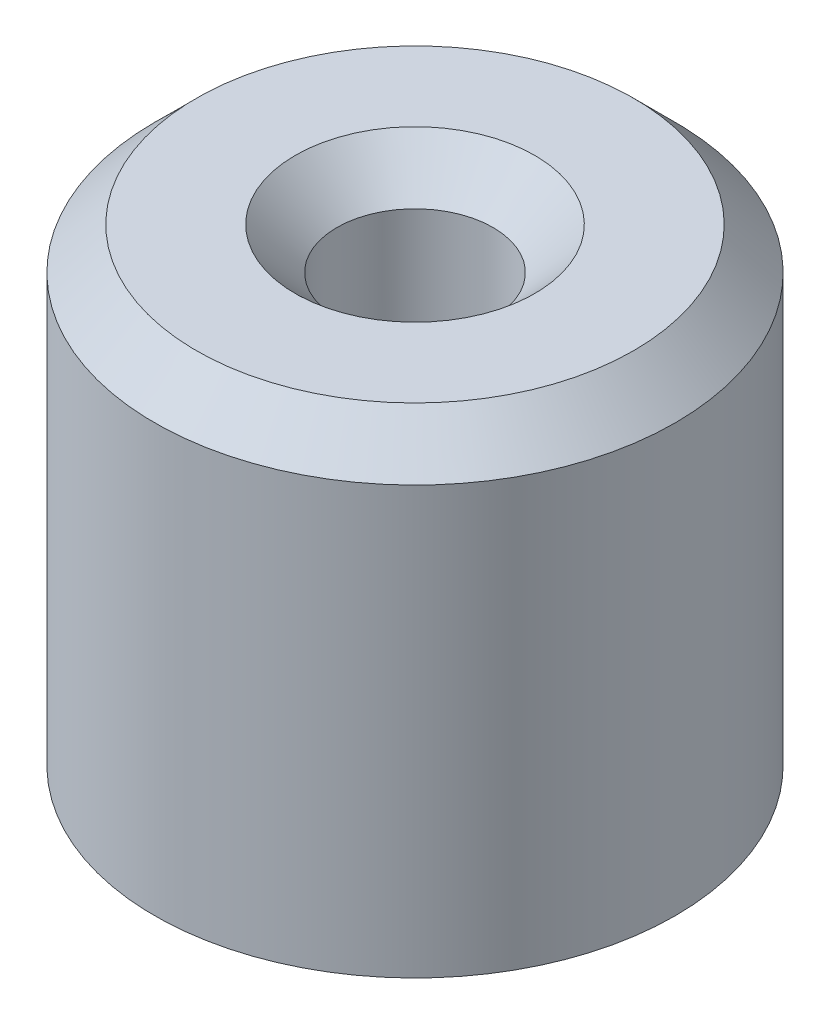
ISO-10303-21;
HEADER;
FILE_DESCRIPTION(('STEP AP214'),'2;1');
FILE_NAME('part.step','',(''),(''),'','','');
FILE_SCHEMA(('AUTOMOTIVE_DESIGN { 1 0 10303 214 1 1 1 1 }'));
ENDSEC;
DATA;
#1=APPLICATION_CONTEXT('core data for automotive mechanical design processes');
#2=APPLICATION_PROTOCOL_DEFINITION('international standard','automotive_design',2000,#1);
#3=PRODUCT_CONTEXT('',#1,'mechanical');
#4=PRODUCT('Part','Part','',(#3));
#5=PRODUCT_RELATED_PRODUCT_CATEGORY('part','',(#4));
#6=PRODUCT_DEFINITION_FORMATION('','',#4);
#7=PRODUCT_DEFINITION_CONTEXT('part definition',#1,'design');
#8=PRODUCT_DEFINITION('design','',#6,#7);
#9=PRODUCT_DEFINITION_SHAPE('','',#8);
#10=(LENGTH_UNIT() NAMED_UNIT(*) SI_UNIT(.MILLI.,.METRE.));
#11=(NAMED_UNIT(*) PLANE_ANGLE_UNIT() SI_UNIT($,.RADIAN.));
#12=(NAMED_UNIT(*) SI_UNIT($,.STERADIAN.) SOLID_ANGLE_UNIT());
#13=UNCERTAINTY_MEASURE_WITH_UNIT(LENGTH_MEASURE(1.E-05),#10,'distance_accuracy_value','');
#14=(GEOMETRIC_REPRESENTATION_CONTEXT(3) GLOBAL_UNCERTAINTY_ASSIGNED_CONTEXT((#13)) GLOBAL_UNIT_ASSIGNED_CONTEXT((#10,
#11,#12)) REPRESENTATION_CONTEXT('',''));
#15=CARTESIAN_POINT('',(0.,0.,0.));
#16=DIRECTION('',(0.,0.,1.));
#17=DIRECTION('',(1.,0.,0.));
#18=AXIS2_PLACEMENT_3D('',#15,#16,#17);
#19=CARTESIAN_POINT('',(16.7831228429026,33.5917620902135,5.85));
#20=DIRECTION('',(0.,-1.,0.));
#21=DIRECTION('',(-1.,0.,0.));
#22=AXIS2_PLACEMENT_3D('',#19,#20,#21);
#23=PLANE('',#22);
#24=CARTESIAN_POINT('',(16.7831228429026,33.5917620902135,5.85));
#25=DIRECTION('',(0.,1.,0.));
#26=DIRECTION('',(1.,0.,0.));
#27=AXIS2_PLACEMENT_3D('',#24,#25,#26);
#28=CIRCLE('',#27,0.75);
#29=CARTESIAN_POINT('',(17.5331228429026,33.5917620902135,5.85));
#30=VERTEX_POINT('',#29);
#31=EDGE_CURVE('E10',#30,#30,#28,.T.);
#32=ORIENTED_EDGE('',*,*,#31,.T.);
#33=EDGE_LOOP('',(#32));
#34=FACE_BOUND('',#33,.T.);
#35=CARTESIAN_POINT('',(16.7831228429026,33.5917620902135,5.85));
#36=DIRECTION('',(0.,-1.,0.));
#37=DIRECTION('',(1.,0.,0.));
#38=AXIS2_PLACEMENT_3D('',#35,#36,#37);
#39=CIRCLE('',#38,2.5);
#40=CARTESIAN_POINT('',(19.2831228429026,33.5917620902135,5.85));
#41=VERTEX_POINT('',#40);
#42=EDGE_CURVE('E33',#41,#41,#39,.T.);
#43=ORIENTED_EDGE('',*,*,#42,.T.);
#44=EDGE_LOOP('',(#43));
#45=FACE_BOUND('',#44,.T.);
#46=ADVANCED_FACE('F15',(#34,#45),#23,.T.);
#47=CARTESIAN_POINT('',(16.7831228429026,34.703035669502,5.85));
#48=DIRECTION('',(0.,-1.,0.));
#49=DIRECTION('',(1.,0.,0.));
#50=AXIS2_PLACEMENT_3D('',#47,#48,#49);
#51=CYLINDRICAL_SURFACE('',#50,0.75);
#52=ORIENTED_EDGE('',*,*,#31,.F.);
#53=EDGE_LOOP('',(#52));
#54=FACE_BOUND('',#53,.T.);
#55=CARTESIAN_POINT('',(16.7831228429026,37.6917620902135,5.85));
#56=DIRECTION('',(0.,-1.,0.));
#57=DIRECTION('',(-1.,0.,0.));
#58=AXIS2_PLACEMENT_3D('',#55,#56,#57);
#59=CIRCLE('',#58,0.75);
#60=CARTESIAN_POINT('',(16.0331228429026,37.6917620902135,5.85));
#61=VERTEX_POINT('',#60);
#62=EDGE_CURVE('E18',#61,#61,#59,.T.);
#63=ORIENTED_EDGE('',*,*,#62,.F.);
#64=EDGE_LOOP('',(#63));
#65=FACE_BOUND('',#64,.T.);
#66=ADVANCED_FACE('F73',(#54,#65),#51,.F.);
#67=CARTESIAN_POINT('',(16.7831228429026,37.8917620902135,5.85));
#68=DIRECTION('',(0.,1.,0.));
#69=DIRECTION('',(-1.,0.,0.));
#70=AXIS2_PLACEMENT_3D('',#67,#68,#69);
#71=CONICAL_SURFACE('',#70,0.95,0.785398163397448);
#72=ORIENTED_EDGE('',*,*,#62,.T.);
#73=EDGE_LOOP('',(#72));
#74=FACE_BOUND('',#73,.T.);
#75=CARTESIAN_POINT('',(16.7831228429026,38.0917620902135,5.85));
#76=DIRECTION('',(0.,1.,0.));
#77=DIRECTION('',(-1.,0.,0.));
#78=AXIS2_PLACEMENT_3D('',#75,#76,#77);
#79=CIRCLE('',#78,1.15);
#80=CARTESIAN_POINT('',(15.6331228429026,38.0917620902135,5.85));
#81=VERTEX_POINT('',#80);
#82=EDGE_CURVE('E40',#81,#81,#79,.T.);
#83=ORIENTED_EDGE('',*,*,#82,.T.);
#84=EDGE_LOOP('',(#83));
#85=FACE_BOUND('',#84,.T.);
#86=ADVANCED_FACE('F53',(#74,#85),#71,.F.);
#87=CARTESIAN_POINT('',(16.7831228429026,34.0917620902135,5.85));
#88=DIRECTION('',(0.,1.,0.));
#89=DIRECTION('',(1.,0.,0.));
#90=AXIS2_PLACEMENT_3D('',#87,#88,#89);
#91=CYLINDRICAL_SURFACE('',#90,2.5);
#92=ORIENTED_EDGE('',*,*,#42,.F.);
#93=EDGE_LOOP('',(#92));
#94=FACE_BOUND('',#93,.T.);
#95=CARTESIAN_POINT('',(16.7831228429026,37.6917620902135,5.85));
#96=DIRECTION('',(0.,1.,0.));
#97=DIRECTION('',(1.,0.,0.));
#98=AXIS2_PLACEMENT_3D('',#95,#96,#97);
#99=CIRCLE('',#98,2.5);
#100=CARTESIAN_POINT('',(19.2831228429026,37.6917620902135,5.85));
#101=VERTEX_POINT('',#100);
#102=EDGE_CURVE('E38',#101,#101,#99,.T.);
#103=ORIENTED_EDGE('',*,*,#102,.F.);
#104=EDGE_LOOP('',(#103));
#105=FACE_BOUND('',#104,.T.);
#106=ADVANCED_FACE('F49',(#94,#105),#91,.T.);
#107=CARTESIAN_POINT('',(16.7831228429026,38.0917620902135,5.85));
#108=DIRECTION('',(0.,1.,0.));
#109=DIRECTION('',(1.,0.,0.));
#110=AXIS2_PLACEMENT_3D('',#107,#108,#109);
#111=PLANE('',#110);
#112=ORIENTED_EDGE('',*,*,#82,.F.);
#113=EDGE_LOOP('',(#112));
#114=FACE_BOUND('',#113,.T.);
#115=CARTESIAN_POINT('',(16.7831228429026,38.0917620902135,5.85));
#116=DIRECTION('',(0.,-1.,0.));
#117=DIRECTION('',(1.,0.,0.));
#118=AXIS2_PLACEMENT_3D('',#115,#116,#117);
#119=CIRCLE('',#118,2.1);
#120=CARTESIAN_POINT('',(18.8831228429026,38.0917620902135,5.85));
#121=VERTEX_POINT('',#120);
#122=EDGE_CURVE('E31',#121,#121,#119,.T.);
#123=ORIENTED_EDGE('',*,*,#122,.F.);
#124=EDGE_LOOP('',(#123));
#125=FACE_BOUND('',#124,.T.);
#126=ADVANCED_FACE('F52',(#114,#125),#111,.T.);
#127=CARTESIAN_POINT('',(16.7831228429026,37.8917620902135,5.85));
#128=DIRECTION('',(0.,-1.,0.));
#129=DIRECTION('',(1.,0.,0.));
#130=AXIS2_PLACEMENT_3D('',#127,#128,#129);
#131=CONICAL_SURFACE('',#130,2.3,0.785398163397448);
#132=ORIENTED_EDGE('',*,*,#102,.T.);
#133=EDGE_LOOP('',(#132));
#134=FACE_BOUND('',#133,.T.);
#135=ORIENTED_EDGE('',*,*,#122,.T.);
#136=EDGE_LOOP('',(#135));
#137=FACE_BOUND('',#136,.T.);
#138=ADVANCED_FACE('F59',(#134,#137),#131,.T.);
#139=CLOSED_SHELL('',(#46,#66,#86,#106,#126,#138));
#140=MANIFOLD_SOLID_BREP('B1',#139);
#141=ADVANCED_BREP_SHAPE_REPRESENTATION('',(#18,#140),#14);
#142=SHAPE_DEFINITION_REPRESENTATION(#9,#141);
ENDSEC;
END-ISO-10303-21;
